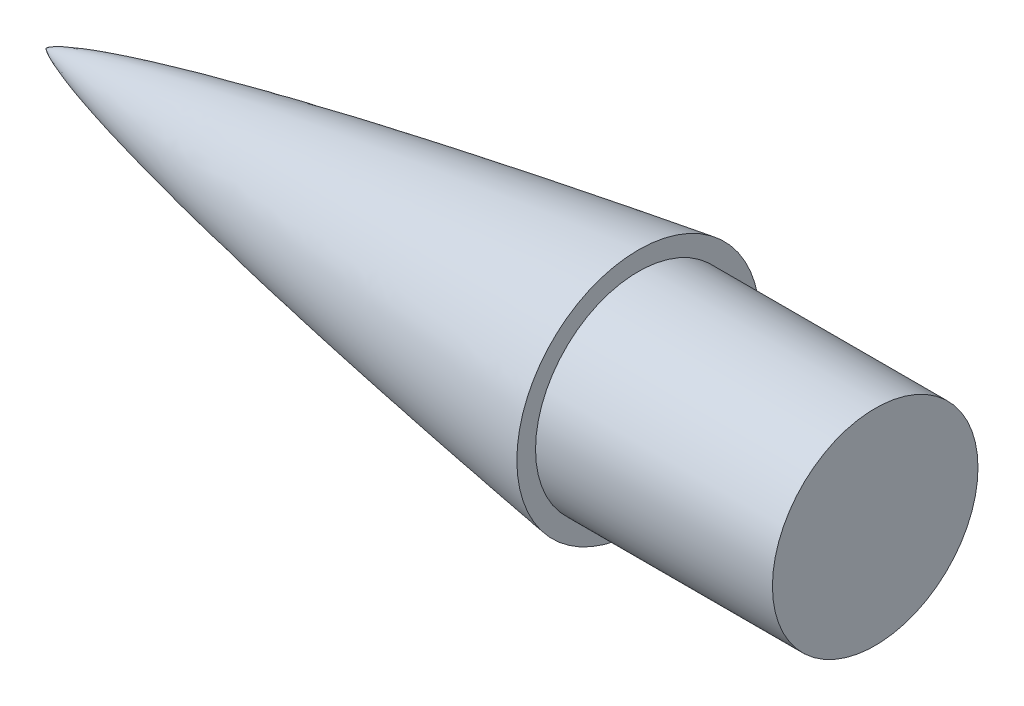
ISO-10303-21;
HEADER;
FILE_DESCRIPTION(('STEP AP214'),'2;1');
FILE_NAME('part.step','',(''),(''),'','','');
FILE_SCHEMA(('AUTOMOTIVE_DESIGN { 1 0 10303 214 1 1 1 1 }'));
ENDSEC;
DATA;
#1=APPLICATION_CONTEXT('core data for automotive mechanical design processes');
#2=APPLICATION_PROTOCOL_DEFINITION('international standard','automotive_design',2000,#1);
#3=PRODUCT_CONTEXT('',#1,'mechanical');
#4=PRODUCT('Part','Part','',(#3));
#5=PRODUCT_RELATED_PRODUCT_CATEGORY('part','',(#4));
#6=PRODUCT_DEFINITION_FORMATION('','',#4);
#7=PRODUCT_DEFINITION_CONTEXT('part definition',#1,'design');
#8=PRODUCT_DEFINITION('design','',#6,#7);
#9=PRODUCT_DEFINITION_SHAPE('','',#8);
#10=(LENGTH_UNIT() NAMED_UNIT(*) SI_UNIT(.MILLI.,.METRE.));
#11=(NAMED_UNIT(*) PLANE_ANGLE_UNIT() SI_UNIT($,.RADIAN.));
#12=(NAMED_UNIT(*) SI_UNIT($,.STERADIAN.) SOLID_ANGLE_UNIT());
#13=UNCERTAINTY_MEASURE_WITH_UNIT(LENGTH_MEASURE(1.E-05),#10,'distance_accuracy_value','');
#14=(GEOMETRIC_REPRESENTATION_CONTEXT(3) GLOBAL_UNCERTAINTY_ASSIGNED_CONTEXT((#13)) GLOBAL_UNIT_ASSIGNED_CONTEXT((#10,
#11,#12)) REPRESENTATION_CONTEXT('',''));
#15=CARTESIAN_POINT('',(0.,0.,0.));
#16=DIRECTION('',(0.,0.,1.));
#17=DIRECTION('',(1.,0.,0.));
#18=AXIS2_PLACEMENT_3D('',#15,#16,#17);
#19=CARTESIAN_POINT('',(63.4999999999997,13.0280749844639,0.));
#20=CARTESIAN_POINT('',(62.4292356150484,12.8671699956377,0.));
#21=CARTESIAN_POINT('',(60.3046579245416,12.5453442228825,0.));
#22=CARTESIAN_POINT('',(56.1035930979973,11.9021966230316,0.));
#23=CARTESIAN_POINT('',(51.9457985690574,11.2441092337971,0.));
#24=CARTESIAN_POINT('',(46.9196061088618,10.4362396420597,0.));
#25=CARTESIAN_POINT('',(42.4236503534832,9.68658934920052,0.));
#26=CARTESIAN_POINT('',(37.6119648056769,8.86529810936314,0.));
#27=CARTESIAN_POINT('',(32.9993826827614,8.04629388864199,0.));
#28=CARTESIAN_POINT('',(28.2739671351475,7.17810601716881,0.));
#29=CARTESIAN_POINT('',(23.6280974007079,6.28352472718444,0.));
#30=CARTESIAN_POINT('',(18.9463138887423,5.33620258060202,0.));
#31=CARTESIAN_POINT('',(14.3055272692327,4.33434919398088,0.));
#32=CARTESIAN_POINT('',(10.0688785336954,3.34319101300349,0.));
#33=CARTESIAN_POINT('',(6.54663928873668,2.42983377777973,0.));
#34=CARTESIAN_POINT('',(3.91986429215595,1.65695649570912,0.));
#35=CARTESIAN_POINT('',(2.30304981430263,1.11267053410973,0.));
#36=CARTESIAN_POINT('',(1.34413627096408,0.742812456426882,0.));
#37=CARTESIAN_POINT('',(0.801272327387047,0.503404043123324,0.));
#38=CARTESIAN_POINT('',(0.4898533626403,0.347787552459397,0.));
#39=CARTESIAN_POINT('',(0.308911319586014,0.245881723772818,0.));
#40=CARTESIAN_POINT('',(0.198903612700681,0.176633841523456,0.));
#41=CARTESIAN_POINT('',(0.13009266248953,0.128429562142205,0.));
#42=CARTESIAN_POINT('',(0.0828574597995564,0.0916940782536659,0.));
#43=CARTESIAN_POINT('',(0.0493013813370426,0.0625282611288535,0.));
#44=CARTESIAN_POINT('',(0.0242826985152863,0.0370786501968285,0.));
#45=CARTESIAN_POINT('',(0.00844910836357211,0.0180188782505055,0.));
#46=CARTESIAN_POINT('',(0.00233683293373597,0.00626124268420581,0.));
#47=CARTESIAN_POINT('',(0.,0.,0.));
#48=B_SPLINE_CURVE_WITH_KNOTS('',4,(#19,#20,#21,#22,#23,#24,#25,#26,#27,#28,#29,#30,#31,#32,#33,
#34,#35,#36,#37,#38,#39,#40,#41,#42,#43,#44,#45,#46,#47),.UNSPECIFIED.,.F.,.F.,(5,1,1,1,1,1,1,1,
1,1,1,1,1,1,1,1,1,1,1,1,1,1,1,1,1,5),(0.,0.066661699697414,0.133323400482518,0.199985100833223,
0.26664680076346,0.333308501354093,0.399970202416409,0.466631903345129,0.533293603422275,
0.599955302803448,0.666616999890129,0.733278703978089,0.799940401147241,0.843282967666046,
0.870745720350727,0.886500148420047,0.895585469517357,0.90080265536009,0.904001286810704,
0.90598519207559,0.907223407744901,0.908079493157305,0.908707969331932,0.909337242389397,
0.909710035157069,0.910082827924742),.UNSPECIFIED.);
#49=CARTESIAN_POINT('',(0.,0.,0.));
#50=DIRECTION('',(-1.,0.,0.));
#51=AXIS1_PLACEMENT('',#49,#50);
#52=SURFACE_OF_REVOLUTION('',#48,#51);
#53=CARTESIAN_POINT('',(0.,0.,0.));
#54=VERTEX_POINT('',#53);
#55=VERTEX_LOOP('',#54);
#56=FACE_BOUND('',#55,.T.);
#57=CARTESIAN_POINT('',(63.5,0.,0.));
#58=DIRECTION('',(-1.,0.,0.));
#59=DIRECTION('',(0.,0.,1.));
#60=AXIS2_PLACEMENT_3D('',#57,#58,#59);
#61=CIRCLE('',#60,13.0280749844639);
#62=CARTESIAN_POINT('',(63.5,0.,13.0280749844639));
#63=VERTEX_POINT('',#62);
#64=EDGE_CURVE('E47',#63,#63,#61,.T.);
#65=ORIENTED_EDGE('',*,*,#64,.T.);
#66=EDGE_LOOP('',(#65));
#67=FACE_BOUND('',#66,.T.);
#68=ADVANCED_FACE('F39',(#56,#67),#52,.T.);
#69=CARTESIAN_POINT('',(63.5,13.0280749844639,0.));
#70=DIRECTION('',(-1.,0.,0.));
#71=DIRECTION('',(0.,0.,1.));
#72=AXIS2_PLACEMENT_3D('',#69,#70,#71);
#73=PLANE('',#72);
#74=CARTESIAN_POINT('',(63.5,0.,0.));
#75=DIRECTION('',(-1.,0.,0.));
#76=DIRECTION('',(0.,0.,1.));
#77=AXIS2_PLACEMENT_3D('',#74,#75,#76);
#78=CIRCLE('',#77,11.0214749844639);
#79=CARTESIAN_POINT('',(63.5,0.,11.0214749844639));
#80=VERTEX_POINT('',#79);
#81=EDGE_CURVE('E11',#80,#80,#78,.F.);
#82=ORIENTED_EDGE('',*,*,#81,.F.);
#83=EDGE_LOOP('',(#82));
#84=FACE_BOUND('',#83,.T.);
#85=ORIENTED_EDGE('',*,*,#64,.F.);
#86=EDGE_LOOP('',(#85));
#87=FACE_BOUND('',#86,.T.);
#88=ADVANCED_FACE('F52',(#84,#87),#73,.F.);
#89=CARTESIAN_POINT('',(88.9,0.,0.));
#90=DIRECTION('',(-1.,0.,0.));
#91=DIRECTION('',(0.,0.,1.));
#92=AXIS2_PLACEMENT_3D('',#89,#90,#91);
#93=CYLINDRICAL_SURFACE('',#92,11.0214749844639);
#94=CARTESIAN_POINT('',(88.9,0.,0.));
#95=DIRECTION('',(1.,0.,0.));
#96=DIRECTION('',(0.,0.,-1.));
#97=AXIS2_PLACEMENT_3D('',#94,#95,#96);
#98=CIRCLE('',#97,11.0214749844639);
#99=CARTESIAN_POINT('',(88.9,0.,-11.0214749844639));
#100=VERTEX_POINT('',#99);
#101=EDGE_CURVE('E57',#100,#100,#98,.T.);
#102=ORIENTED_EDGE('',*,*,#101,.F.);
#103=EDGE_LOOP('',(#102));
#104=FACE_BOUND('',#103,.T.);
#105=ORIENTED_EDGE('',*,*,#81,.T.);
#106=EDGE_LOOP('',(#105));
#107=FACE_BOUND('',#106,.T.);
#108=ADVANCED_FACE('F71',(#104,#107),#93,.T.);
#109=CARTESIAN_POINT('',(88.9,0.,0.));
#110=DIRECTION('',(1.,0.,0.));
#111=DIRECTION('',(0.,0.,-1.));
#112=AXIS2_PLACEMENT_3D('',#109,#110,#111);
#113=PLANE('',#112);
#114=ORIENTED_EDGE('',*,*,#101,.T.);
#115=EDGE_LOOP('',(#114));
#116=FACE_BOUND('',#115,.T.);
#117=ADVANCED_FACE('F69',(#116),#113,.T.);
#118=CLOSED_SHELL('',(#68,#88,#108,#117));
#119=MANIFOLD_SOLID_BREP('B2',#118);
#120=ADVANCED_BREP_SHAPE_REPRESENTATION('',(#18,#119),#14);
#121=SHAPE_DEFINITION_REPRESENTATION(#9,#120);
ENDSEC;
END-ISO-10303-21;
